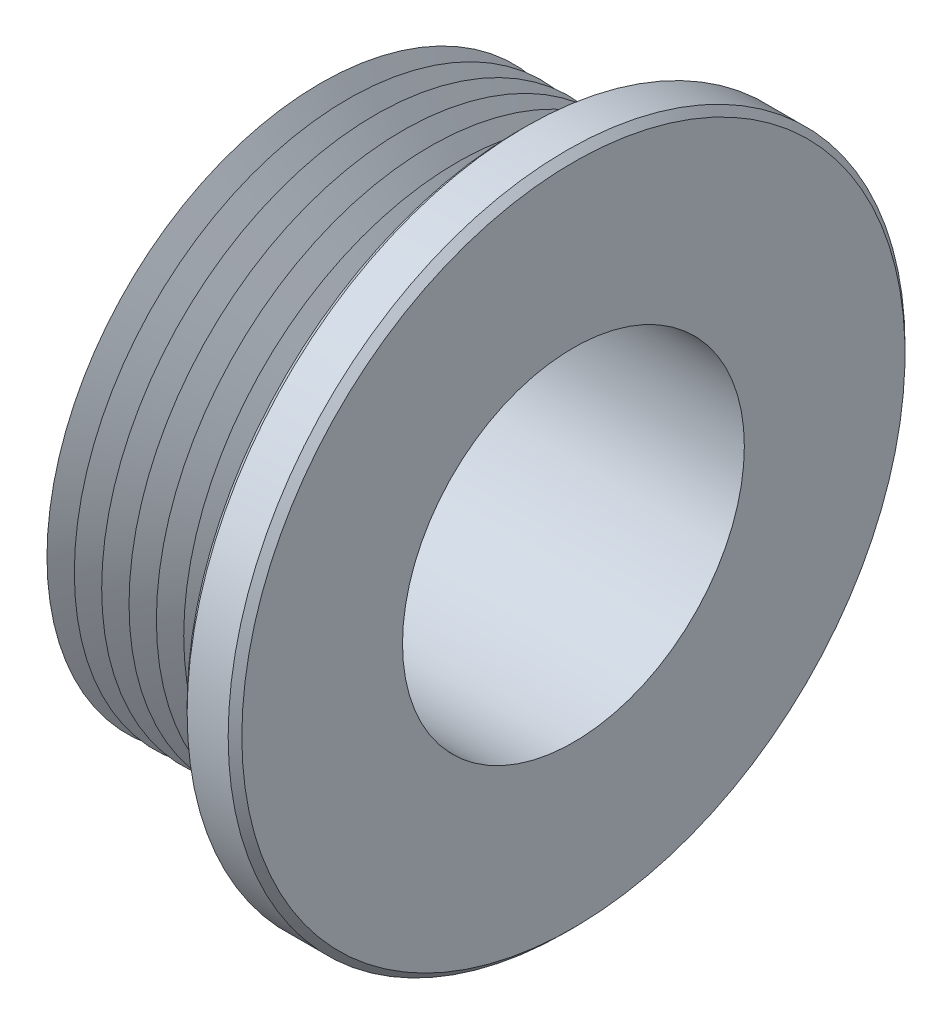
ISO-10303-21;
HEADER;
FILE_DESCRIPTION(('STEP AP214'),'2;1');
FILE_NAME('part.step','',(''),(''),'','','');
FILE_SCHEMA(('AUTOMOTIVE_DESIGN { 1 0 10303 214 1 1 1 1 }'));
ENDSEC;
DATA;
#1=APPLICATION_CONTEXT('core data for automotive mechanical design processes');
#2=APPLICATION_PROTOCOL_DEFINITION('international standard','automotive_design',2000,#1);
#3=PRODUCT_CONTEXT('',#1,'mechanical');
#4=PRODUCT('Part','Part','',(#3));
#5=PRODUCT_RELATED_PRODUCT_CATEGORY('part','',(#4));
#6=PRODUCT_DEFINITION_FORMATION('','',#4);
#7=PRODUCT_DEFINITION_CONTEXT('part definition',#1,'design');
#8=PRODUCT_DEFINITION('design','',#6,#7);
#9=PRODUCT_DEFINITION_SHAPE('','',#8);
#10=(LENGTH_UNIT() NAMED_UNIT(*) SI_UNIT(.MILLI.,.METRE.));
#11=(NAMED_UNIT(*) PLANE_ANGLE_UNIT() SI_UNIT($,.RADIAN.));
#12=(NAMED_UNIT(*) SI_UNIT($,.STERADIAN.) SOLID_ANGLE_UNIT());
#13=UNCERTAINTY_MEASURE_WITH_UNIT(LENGTH_MEASURE(1.E-05),#10,'distance_accuracy_value','');
#14=(GEOMETRIC_REPRESENTATION_CONTEXT(3) GLOBAL_UNCERTAINTY_ASSIGNED_CONTEXT((#13)) GLOBAL_UNIT_ASSIGNED_CONTEXT((#10,
#11,#12)) REPRESENTATION_CONTEXT('',''));
#15=CARTESIAN_POINT('',(0.,0.,0.));
#16=DIRECTION('',(0.,0.,1.));
#17=DIRECTION('',(1.,0.,0.));
#18=AXIS2_PLACEMENT_3D('',#15,#16,#17);
#19=CARTESIAN_POINT('',(-1.30000000001473,0.,0.));
#20=DIRECTION('',(1.,0.,0.));
#21=DIRECTION('',(0.,0.,-1.));
#22=AXIS2_PLACEMENT_3D('',#19,#20,#21);
#23=CONICAL_SURFACE('',#22,4.0000000000191,1.04718484909684);
#24=CARTESIAN_POINT('',(-1.50000000002137,0.,0.));
#25=DIRECTION('',(-1.,0.,0.));
#26=DIRECTION('',(0.,0.,1.));
#27=AXIS2_PLACEMENT_3D('',#24,#25,#26);
#28=CIRCLE('',#27,3.65360000006376);
#29=CARTESIAN_POINT('',(-1.50000000002137,0.,3.65360000006376));
#30=VERTEX_POINT('',#29);
#31=EDGE_CURVE('E29',#30,#30,#28,.T.);
#32=ORIENTED_EDGE('',*,*,#31,.F.);
#33=EDGE_LOOP('',(#32));
#34=FACE_BOUND('',#33,.T.);
#35=CARTESIAN_POINT('',(-1.29999999995789,0.,0.));
#36=DIRECTION('',(-1.,0.,0.));
#37=DIRECTION('',(0.,0.,1.));
#38=AXIS2_PLACEMENT_3D('',#35,#36,#37);
#39=CIRCLE('',#38,4.0000000000191);
#40=CARTESIAN_POINT('',(-1.29999999995789,0.,4.0000000000191));
#41=VERTEX_POINT('',#40);
#42=EDGE_CURVE('E75',#41,#41,#39,.F.);
#43=ORIENTED_EDGE('',*,*,#42,.F.);
#44=EDGE_LOOP('',(#43));
#45=FACE_BOUND('',#44,.T.);
#46=ADVANCED_FACE('F14',(#34,#45),#23,.T.);
#47=CARTESIAN_POINT('',(-1.69999999997117,0.,0.));
#48=DIRECTION('',(-1.,0.,0.));
#49=DIRECTION('',(0.,0.,1.));
#50=AXIS2_PLACEMENT_3D('',#47,#48,#49);
#51=CONICAL_SURFACE('',#50,4.0000000000191,1.04718484907779);
#52=ORIENTED_EDGE('',*,*,#31,.T.);
#53=EDGE_LOOP('',(#52));
#54=FACE_BOUND('',#53,.T.);
#55=CARTESIAN_POINT('',(-1.70000000002801,0.,0.));
#56=DIRECTION('',(1.,0.,0.));
#57=DIRECTION('',(0.,0.,1.));
#58=AXIS2_PLACEMENT_3D('',#55,#56,#57);
#59=CIRCLE('',#58,4.0000000000191);
#60=CARTESIAN_POINT('',(-1.70000000002801,0.,4.0000000000191));
#61=VERTEX_POINT('',#60);
#62=EDGE_CURVE('E73',#61,#61,#59,.F.);
#63=ORIENTED_EDGE('',*,*,#62,.F.);
#64=EDGE_LOOP('',(#63));
#65=FACE_BOUND('',#64,.T.);
#66=ADVANCED_FACE('F82',(#54,#65),#51,.T.);
#67=CARTESIAN_POINT('',(-1.29999999995789,0.,0.));
#68=DIRECTION('',(-1.,0.,0.));
#69=DIRECTION('',(0.,0.,1.));
#70=AXIS2_PLACEMENT_3D('',#67,#68,#69);
#71=CONICAL_SURFACE('',#70,4.0000000000191,1.04718484907779);
#72=ORIENTED_EDGE('',*,*,#42,.T.);
#73=EDGE_LOOP('',(#72));
#74=FACE_BOUND('',#73,.T.);
#75=CARTESIAN_POINT('',(-1.09999999995125,0.,0.));
#76=DIRECTION('',(1.,0.,0.));
#77=DIRECTION('',(0.,0.,1.));
#78=AXIS2_PLACEMENT_3D('',#75,#76,#77);
#79=CIRCLE('',#78,3.65360000006376);
#80=CARTESIAN_POINT('',(-1.09999999995125,0.,3.65360000006376));
#81=VERTEX_POINT('',#80);
#82=EDGE_CURVE('E70',#81,#81,#79,.T.);
#83=ORIENTED_EDGE('',*,*,#82,.F.);
#84=EDGE_LOOP('',(#83));
#85=FACE_BOUND('',#84,.T.);
#86=ADVANCED_FACE('F91',(#74,#85),#71,.T.);
#87=CARTESIAN_POINT('',(-1.70000000002801,0.,0.));
#88=DIRECTION('',(1.,0.,0.));
#89=DIRECTION('',(0.,1.,0.));
#90=AXIS2_PLACEMENT_3D('',#87,#88,#89);
#91=CONICAL_SURFACE('',#90,4.0000000000191,1.04718484909684);
#92=ORIENTED_EDGE('',*,*,#62,.T.);
#93=EDGE_LOOP('',(#92));
#94=FACE_BOUND('',#93,.T.);
#95=CARTESIAN_POINT('',(-1.90000000003465,0.,0.));
#96=DIRECTION('',(-1.,0.,0.));
#97=DIRECTION('',(0.,0.,1.));
#98=AXIS2_PLACEMENT_3D('',#95,#96,#97);
#99=CIRCLE('',#98,3.65360000006376);
#100=CARTESIAN_POINT('',(-1.90000000003465,0.,3.65360000006376));
#101=VERTEX_POINT('',#100);
#102=EDGE_CURVE('E67',#101,#101,#99,.T.);
#103=ORIENTED_EDGE('',*,*,#102,.F.);
#104=EDGE_LOOP('',(#103));
#105=FACE_BOUND('',#104,.T.);
#106=ADVANCED_FACE('F161',(#94,#105),#91,.T.);
#107=CARTESIAN_POINT('',(-0.900000000001455,0.,0.));
#108=DIRECTION('',(1.,0.,0.));
#109=DIRECTION('',(0.,0.,-1.));
#110=AXIS2_PLACEMENT_3D('',#107,#108,#109);
#111=CONICAL_SURFACE('',#110,4.0000000000191,1.04718484907779);
#112=ORIENTED_EDGE('',*,*,#82,.T.);
#113=EDGE_LOOP('',(#112));
#114=FACE_BOUND('',#113,.T.);
#115=CARTESIAN_POINT('',(-0.900000000001455,0.,0.));
#116=DIRECTION('',(-1.,0.,0.));
#117=DIRECTION('',(0.,0.,1.));
#118=AXIS2_PLACEMENT_3D('',#115,#116,#117);
#119=CIRCLE('',#118,4.0000000000191);
#120=CARTESIAN_POINT('',(-0.900000000001455,0.,4.0000000000191));
#121=VERTEX_POINT('',#120);
#122=EDGE_CURVE('E64',#121,#121,#119,.F.);
#123=ORIENTED_EDGE('',*,*,#122,.F.);
#124=EDGE_LOOP('',(#123));
#125=FACE_BOUND('',#124,.T.);
#126=ADVANCED_FACE('F157',(#114,#125),#111,.T.);
#127=CARTESIAN_POINT('',(-2.09999999998445,0.,0.));
#128=DIRECTION('',(-1.,0.,0.));
#129=DIRECTION('',(0.,0.,1.));
#130=AXIS2_PLACEMENT_3D('',#127,#128,#129);
#131=CONICAL_SURFACE('',#130,4.0000000000191,1.04718484907779);
#132=ORIENTED_EDGE('',*,*,#102,.T.);
#133=EDGE_LOOP('',(#132));
#134=FACE_BOUND('',#133,.T.);
#135=CARTESIAN_POINT('',(-2.10000000004129,0.,0.));
#136=DIRECTION('',(1.,0.,0.));
#137=DIRECTION('',(0.,0.,1.));
#138=AXIS2_PLACEMENT_3D('',#135,#136,#137);
#139=CIRCLE('',#138,4.0000000000191);
#140=CARTESIAN_POINT('',(-2.10000000004129,0.,4.0000000000191));
#141=VERTEX_POINT('',#140);
#142=EDGE_CURVE('E59',#141,#141,#139,.F.);
#143=ORIENTED_EDGE('',*,*,#142,.F.);
#144=EDGE_LOOP('',(#143));
#145=FACE_BOUND('',#144,.T.);
#146=ADVANCED_FACE('F153',(#134,#145),#131,.T.);
#147=CARTESIAN_POINT('',(-0.900000000001455,0.,0.));
#148=DIRECTION('',(-1.,0.,0.));
#149=DIRECTION('',(0.,0.,1.));
#150=AXIS2_PLACEMENT_3D('',#147,#148,#149);
#151=CONICAL_SURFACE('',#150,4.0000000000191,1.04718484907779);
#152=ORIENTED_EDGE('',*,*,#122,.T.);
#153=EDGE_LOOP('',(#152));
#154=FACE_BOUND('',#153,.T.);
#155=CARTESIAN_POINT('',(-0.700000000051659,0.,0.));
#156=DIRECTION('',(-1.,0.,0.));
#157=DIRECTION('',(0.,0.,1.));
#158=AXIS2_PLACEMENT_3D('',#155,#156,#157);
#159=CIRCLE('',#158,3.65360000006376);
#160=CARTESIAN_POINT('',(-0.700000000051659,0.,3.65360000006376));
#161=VERTEX_POINT('',#160);
#162=EDGE_CURVE('E17',#161,#161,#159,.T.);
#163=ORIENTED_EDGE('',*,*,#162,.T.);
#164=EDGE_LOOP('',(#163));
#165=FACE_BOUND('',#164,.T.);
#166=ADVANCED_FACE('F149',(#154,#165),#151,.T.);
#167=CARTESIAN_POINT('',(-2.10000000004129,0.,0.));
#168=DIRECTION('',(1.,0.,0.));
#169=DIRECTION('',(0.,0.,-1.));
#170=AXIS2_PLACEMENT_3D('',#167,#168,#169);
#171=CONICAL_SURFACE('',#170,4.0000000000191,1.04718484907779);
#172=ORIENTED_EDGE('',*,*,#142,.T.);
#173=EDGE_LOOP('',(#172));
#174=FACE_BOUND('',#173,.T.);
#175=CARTESIAN_POINT('',(-2.30000000004793,0.,0.));
#176=DIRECTION('',(-1.,0.,0.));
#177=DIRECTION('',(0.,0.,1.));
#178=AXIS2_PLACEMENT_3D('',#175,#176,#177);
#179=CIRCLE('',#178,3.65360000006376);
#180=CARTESIAN_POINT('',(-2.30000000004793,0.,3.65360000006376));
#181=VERTEX_POINT('',#180);
#182=EDGE_CURVE('E49',#181,#181,#179,.T.);
#183=ORIENTED_EDGE('',*,*,#182,.F.);
#184=EDGE_LOOP('',(#183));
#185=FACE_BOUND('',#184,.T.);
#186=ADVANCED_FACE('F145',(#174,#185),#171,.T.);
#187=CARTESIAN_POINT('',(-0.7,0.,0.));
#188=DIRECTION('',(-1.,0.,0.));
#189=DIRECTION('',(0.,0.,1.));
#190=AXIS2_PLACEMENT_3D('',#187,#188,#189);
#191=PLANE('',#190);
#192=CARTESIAN_POINT('',(-0.7,0.,0.));
#193=DIRECTION('',(-1.,0.,0.));
#194=DIRECTION('',(0.,0.,1.));
#195=AXIS2_PLACEMENT_3D('',#192,#193,#194);
#196=CIRCLE('',#195,3.5);
#197=CARTESIAN_POINT('',(-0.7,0.,3.5));
#198=VERTEX_POINT('',#197);
#199=EDGE_CURVE('E47',#198,#198,#196,.F.);
#200=ORIENTED_EDGE('',*,*,#199,.F.);
#201=EDGE_LOOP('',(#200));
#202=FACE_BOUND('',#201,.T.);
#203=ORIENTED_EDGE('',*,*,#162,.F.);
#204=EDGE_LOOP('',(#203));
#205=FACE_BOUND('',#204,.T.);
#206=ADVANCED_FACE('F142',(#202,#205),#191,.F.);
#207=CARTESIAN_POINT('',(-2.49999999999773,0.,0.));
#208=DIRECTION('',(-1.,0.,0.));
#209=DIRECTION('',(0.,0.,1.));
#210=AXIS2_PLACEMENT_3D('',#207,#208,#209);
#211=CONICAL_SURFACE('',#210,4.0000000000191,1.04718484907779);
#212=ORIENTED_EDGE('',*,*,#182,.T.);
#213=EDGE_LOOP('',(#212));
#214=FACE_BOUND('',#213,.T.);
#215=CARTESIAN_POINT('',(-2.49999999999773,0.,0.));
#216=DIRECTION('',(1.,0.,0.));
#217=DIRECTION('',(0.,0.,1.));
#218=AXIS2_PLACEMENT_3D('',#215,#216,#217);
#219=CIRCLE('',#218,4.0000000000191);
#220=CARTESIAN_POINT('',(-2.49999999999773,0.,4.0000000000191));
#221=VERTEX_POINT('',#220);
#222=EDGE_CURVE('E46',#221,#221,#219,.F.);
#223=ORIENTED_EDGE('',*,*,#222,.F.);
#224=EDGE_LOOP('',(#223));
#225=FACE_BOUND('',#224,.T.);
#226=ADVANCED_FACE('F138',(#214,#225),#211,.T.);
#227=CARTESIAN_POINT('',(-1.55,0.,0.));
#228=DIRECTION('',(-1.,0.,0.));
#229=DIRECTION('',(0.,0.,1.));
#230=AXIS2_PLACEMENT_3D('',#227,#228,#229);
#231=CYLINDRICAL_SURFACE('',#230,3.5);
#232=CARTESIAN_POINT('',(0.,0.,0.));
#233=DIRECTION('',(-1.,0.,0.));
#234=DIRECTION('',(0.,0.,1.));
#235=AXIS2_PLACEMENT_3D('',#232,#233,#234);
#236=CIRCLE('',#235,3.5);
#237=CARTESIAN_POINT('',(0.,0.,3.5));
#238=VERTEX_POINT('',#237);
#239=EDGE_CURVE('E44',#238,#238,#236,.F.);
#240=ORIENTED_EDGE('',*,*,#239,.F.);
#241=EDGE_LOOP('',(#240));
#242=FACE_BOUND('',#241,.T.);
#243=ORIENTED_EDGE('',*,*,#199,.T.);
#244=EDGE_LOOP('',(#243));
#245=FACE_BOUND('',#244,.T.);
#246=ADVANCED_FACE('F134',(#242,#245),#231,.T.);
#247=CARTESIAN_POINT('',(-2.49999999999773,0.,0.));
#248=DIRECTION('',(1.,0.,0.));
#249=DIRECTION('',(0.,0.,-1.));
#250=AXIS2_PLACEMENT_3D('',#247,#248,#249);
#251=CONICAL_SURFACE('',#250,4.0000000000191,1.04718484907779);
#252=ORIENTED_EDGE('',*,*,#222,.T.);
#253=EDGE_LOOP('',(#252));
#254=FACE_BOUND('',#253,.T.);
#255=CARTESIAN_POINT('',(-2.70000000000437,0.,0.));
#256=DIRECTION('',(-1.,0.,0.));
#257=DIRECTION('',(0.,0.,1.));
#258=AXIS2_PLACEMENT_3D('',#255,#256,#257);
#259=CIRCLE('',#258,3.65360000006376);
#260=CARTESIAN_POINT('',(-2.70000000000437,0.,3.65360000006376));
#261=VERTEX_POINT('',#260);
#262=EDGE_CURVE('E43',#261,#261,#259,.T.);
#263=ORIENTED_EDGE('',*,*,#262,.F.);
#264=EDGE_LOOP('',(#263));
#265=FACE_BOUND('',#264,.T.);
#266=ADVANCED_FACE('F130',(#254,#265),#251,.T.);
#267=CARTESIAN_POINT('',(0.,0.,4.225));
#268=DIRECTION('',(-1.,0.,0.));
#269=DIRECTION('',(0.,0.,1.));
#270=AXIS2_PLACEMENT_3D('',#267,#268,#269);
#271=PLANE('',#270);
#272=ORIENTED_EDGE('',*,*,#239,.T.);
#273=EDGE_LOOP('',(#272));
#274=FACE_BOUND('',#273,.T.);
#275=CARTESIAN_POINT('',(-5.6843418860808E-11,0.,0.));
#276=DIRECTION('',(1.,0.,0.));
#277=DIRECTION('',(0.,0.,-1.));
#278=AXIS2_PLACEMENT_3D('',#275,#276,#277);
#279=CIRCLE('',#278,4.84999999997626);
#280=CARTESIAN_POINT('',(-5.6843418860808E-11,0.,-4.84999999997626));
#281=VERTEX_POINT('',#280);
#282=EDGE_CURVE('E39',#281,#281,#279,.T.);
#283=ORIENTED_EDGE('',*,*,#282,.F.);
#284=EDGE_LOOP('',(#283));
#285=FACE_BOUND('',#284,.T.);
#286=ADVANCED_FACE('F126',(#274,#285),#271,.T.);
#287=CARTESIAN_POINT('',(-2.89999999995416,0.,0.));
#288=DIRECTION('',(-1.,0.,0.));
#289=DIRECTION('',(0.,0.,1.));
#290=AXIS2_PLACEMENT_3D('',#287,#288,#289);
#291=CONICAL_SURFACE('',#290,4.0000000000191,1.04718484907779);
#292=ORIENTED_EDGE('',*,*,#262,.T.);
#293=EDGE_LOOP('',(#292));
#294=FACE_BOUND('',#293,.T.);
#295=CARTESIAN_POINT('',(-2.900000000011,0.,0.));
#296=DIRECTION('',(1.,0.,0.));
#297=DIRECTION('',(0.,0.,1.));
#298=AXIS2_PLACEMENT_3D('',#295,#296,#297);
#299=CIRCLE('',#298,4.0000000000191);
#300=CARTESIAN_POINT('',(-2.900000000011,0.,4.0000000000191));
#301=VERTEX_POINT('',#300);
#302=EDGE_CURVE('E42',#301,#301,#299,.F.);
#303=ORIENTED_EDGE('',*,*,#302,.F.);
#304=EDGE_LOOP('',(#303));
#305=FACE_BOUND('',#304,.T.);
#306=ADVANCED_FACE('F122',(#294,#305),#291,.T.);
#307=CARTESIAN_POINT('',(0.100000000031741,0.,0.));
#308=DIRECTION('',(1.,0.,0.));
#309=DIRECTION('',(0.,0.,-1.));
#310=AXIS2_PLACEMENT_3D('',#307,#308,#309);
#311=CONICAL_SURFACE('',#310,4.95000000006485,0.785398163397448);
#312=CARTESIAN_POINT('',(0.1,0.,0.));
#313=DIRECTION('',(-1.,0.,0.));
#314=DIRECTION('',(0.,0.,1.));
#315=AXIS2_PLACEMENT_3D('',#312,#313,#314);
#316=CIRCLE('',#315,4.95);
#317=CARTESIAN_POINT('',(0.1,0.,4.95));
#318=VERTEX_POINT('',#317);
#319=EDGE_CURVE('E38',#318,#318,#316,.F.);
#320=ORIENTED_EDGE('',*,*,#319,.F.);
#321=EDGE_LOOP('',(#320));
#322=FACE_BOUND('',#321,.T.);
#323=ORIENTED_EDGE('',*,*,#282,.T.);
#324=EDGE_LOOP('',(#323));
#325=FACE_BOUND('',#324,.T.);
#326=ADVANCED_FACE('F118',(#322,#325),#311,.T.);
#327=CARTESIAN_POINT('',(-2.90000000006785,0.,0.));
#328=DIRECTION('',(1.,0.,0.));
#329=DIRECTION('',(0.,0.,-1.));
#330=AXIS2_PLACEMENT_3D('',#327,#328,#329);
#331=CONICAL_SURFACE('',#330,3.99999999990541,1.04718484895472);
#332=ORIENTED_EDGE('',*,*,#302,.T.);
#333=EDGE_LOOP('',(#332));
#334=FACE_BOUND('',#333,.T.);
#335=CARTESIAN_POINT('',(-3.10000000000885,0.,0.));
#336=DIRECTION('',(1.,0.,0.));
#337=DIRECTION('',(0.,0.,-1.));
#338=AXIS2_PLACEMENT_3D('',#335,#336,#337);
#339=CIRCLE('',#338,3.65360000006376);
#340=CARTESIAN_POINT('',(-3.10000000000885,0.,-3.65360000006376));
#341=VERTEX_POINT('',#340);
#342=EDGE_CURVE('E35',#341,#341,#339,.F.);
#343=ORIENTED_EDGE('',*,*,#342,.F.);
#344=EDGE_LOOP('',(#343));
#345=FACE_BOUND('',#344,.T.);
#346=ADVANCED_FACE('F114',(#334,#345),#331,.T.);
#347=CARTESIAN_POINT('',(0.4,0.,0.));
#348=DIRECTION('',(-1.,0.,0.));
#349=DIRECTION('',(0.,0.,1.));
#350=AXIS2_PLACEMENT_3D('',#347,#348,#349);
#351=CYLINDRICAL_SURFACE('',#350,4.95);
#352=CARTESIAN_POINT('',(0.699999999994816,0.,0.));
#353=DIRECTION('',(-1.,0.,0.));
#354=DIRECTION('',(0.,0.,1.));
#355=AXIS2_PLACEMENT_3D('',#352,#353,#354);
#356=CIRCLE('',#355,4.950000000008);
#357=CARTESIAN_POINT('',(0.699999999994816,0.,4.950000000008));
#358=VERTEX_POINT('',#357);
#359=EDGE_CURVE('E34',#358,#358,#356,.F.);
#360=ORIENTED_EDGE('',*,*,#359,.F.);
#361=EDGE_LOOP('',(#360));
#362=FACE_BOUND('',#361,.T.);
#363=ORIENTED_EDGE('',*,*,#319,.T.);
#364=EDGE_LOOP('',(#363));
#365=FACE_BOUND('',#364,.T.);
#366=ADVANCED_FACE('F110',(#362,#365),#351,.T.);
#367=CARTESIAN_POINT('',(-3.1,0.,3.));
#368=DIRECTION('',(-1.,0.,0.));
#369=DIRECTION('',(0.,0.,1.));
#370=AXIS2_PLACEMENT_3D('',#367,#368,#369);
#371=PLANE('',#370);
#372=CARTESIAN_POINT('',(-3.1,0.,0.));
#373=DIRECTION('',(-1.,0.,0.));
#374=DIRECTION('',(0.,0.,1.));
#375=AXIS2_PLACEMENT_3D('',#372,#373,#374);
#376=CIRCLE('',#375,2.5);
#377=CARTESIAN_POINT('',(-3.1,0.,2.5));
#378=VERTEX_POINT('',#377);
#379=EDGE_CURVE('E26',#378,#378,#376,.F.);
#380=ORIENTED_EDGE('',*,*,#379,.T.);
#381=EDGE_LOOP('',(#380));
#382=FACE_BOUND('',#381,.T.);
#383=ORIENTED_EDGE('',*,*,#342,.T.);
#384=EDGE_LOOP('',(#383));
#385=FACE_BOUND('',#384,.T.);
#386=ADVANCED_FACE('F106',(#382,#385),#371,.T.);
#387=CARTESIAN_POINT('',(0.699999999937972,0.,0.));
#388=DIRECTION('',(-1.,0.,0.));
#389=DIRECTION('',(0.,0.,1.));
#390=AXIS2_PLACEMENT_3D('',#387,#388,#389);
#391=CONICAL_SURFACE('',#390,4.95000000006485,0.785398163397448);
#392=CARTESIAN_POINT('',(0.800000000026557,0.,0.));
#393=DIRECTION('',(-1.,0.,0.));
#394=DIRECTION('',(0.,0.,1.));
#395=AXIS2_PLACEMENT_3D('',#392,#393,#394);
#396=CIRCLE('',#395,4.84999999997626);
#397=CARTESIAN_POINT('',(0.800000000026557,0.,4.84999999997626));
#398=VERTEX_POINT('',#397);
#399=EDGE_CURVE('E21',#398,#398,#396,.F.);
#400=ORIENTED_EDGE('',*,*,#399,.F.);
#401=EDGE_LOOP('',(#400));
#402=FACE_BOUND('',#401,.T.);
#403=ORIENTED_EDGE('',*,*,#359,.T.);
#404=EDGE_LOOP('',(#403));
#405=FACE_BOUND('',#404,.T.);
#406=ADVANCED_FACE('F99',(#402,#405),#391,.T.);
#407=CARTESIAN_POINT('',(-1.15,0.,0.));
#408=DIRECTION('',(-1.,0.,0.));
#409=DIRECTION('',(0.,0.,1.));
#410=AXIS2_PLACEMENT_3D('',#407,#408,#409);
#411=CYLINDRICAL_SURFACE('',#410,2.5);
#412=ORIENTED_EDGE('',*,*,#379,.F.);
#413=EDGE_LOOP('',(#412));
#414=FACE_BOUND('',#413,.T.);
#415=CARTESIAN_POINT('',(0.800000000000001,0.,0.));
#416=DIRECTION('',(-1.,0.,0.));
#417=DIRECTION('',(0.,0.,1.));
#418=AXIS2_PLACEMENT_3D('',#415,#416,#417);
#419=CIRCLE('',#418,2.5);
#420=CARTESIAN_POINT('',(0.800000000000001,0.,2.5));
#421=VERTEX_POINT('',#420);
#422=EDGE_CURVE('E10',#421,#421,#419,.T.);
#423=ORIENTED_EDGE('',*,*,#422,.F.);
#424=EDGE_LOOP('',(#423));
#425=FACE_BOUND('',#424,.T.);
#426=ADVANCED_FACE('F94',(#414,#425),#411,.F.);
#427=CARTESIAN_POINT('',(0.800000000000001,0.,3.725));
#428=DIRECTION('',(1.,0.,0.));
#429=DIRECTION('',(0.,0.,-1.));
#430=AXIS2_PLACEMENT_3D('',#427,#428,#429);
#431=PLANE('',#430);
#432=ORIENTED_EDGE('',*,*,#422,.T.);
#433=EDGE_LOOP('',(#432));
#434=FACE_BOUND('',#433,.T.);
#435=ORIENTED_EDGE('',*,*,#399,.T.);
#436=EDGE_LOOP('',(#435));
#437=FACE_BOUND('',#436,.T.);
#438=ADVANCED_FACE('F92',(#434,#437),#431,.T.);
#439=CLOSED_SHELL('',(#46,#66,#86,#106,#126,#146,#166,#186,#206,#226,#246,#266,#286,#306,#326,
#346,#366,#386,#406,#426,#438));
#440=MANIFOLD_SOLID_BREP('B1',#439);
#441=ADVANCED_BREP_SHAPE_REPRESENTATION('',(#18,#440),#14);
#442=SHAPE_DEFINITION_REPRESENTATION(#9,#441);
ENDSEC;
END-ISO-10303-21;
